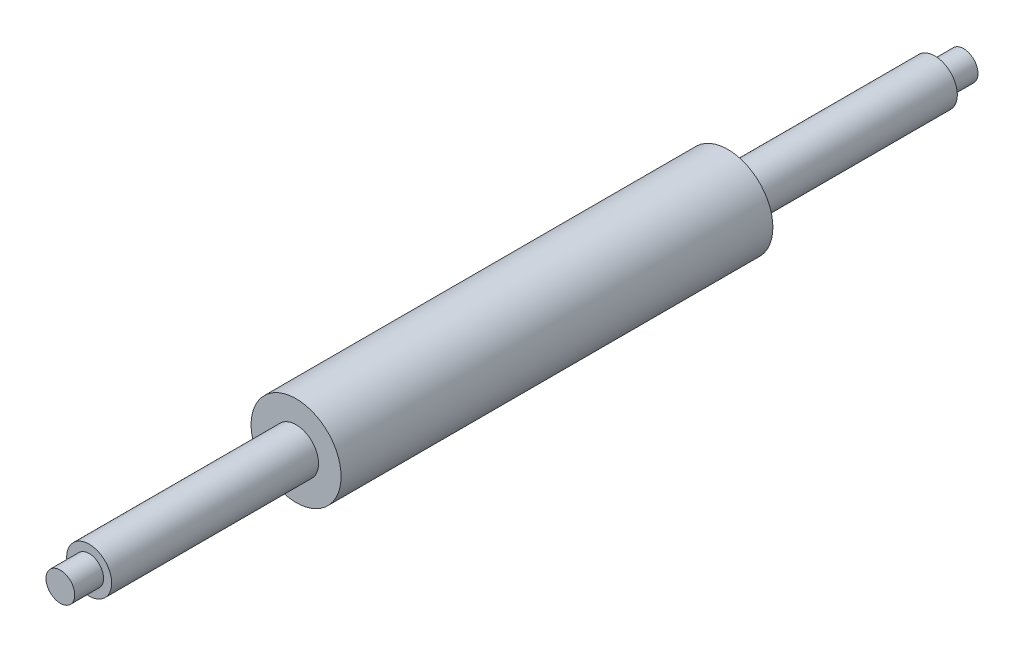
ISO-10303-21;
HEADER;
FILE_DESCRIPTION(('STEP AP214'),'2;1');
FILE_NAME('part.step','',(''),(''),'','','');
FILE_SCHEMA(('AUTOMOTIVE_DESIGN { 1 0 10303 214 1 1 1 1 }'));
ENDSEC;
DATA;
#1=APPLICATION_CONTEXT('core data for automotive mechanical design processes');
#2=APPLICATION_PROTOCOL_DEFINITION('international standard','automotive_design',2000,#1);
#3=PRODUCT_CONTEXT('',#1,'mechanical');
#4=PRODUCT('Part','Part','',(#3));
#5=PRODUCT_RELATED_PRODUCT_CATEGORY('part','',(#4));
#6=PRODUCT_DEFINITION_FORMATION('','',#4);
#7=PRODUCT_DEFINITION_CONTEXT('part definition',#1,'design');
#8=PRODUCT_DEFINITION('design','',#6,#7);
#9=PRODUCT_DEFINITION_SHAPE('','',#8);
#10=(LENGTH_UNIT() NAMED_UNIT(*) SI_UNIT(.MILLI.,.METRE.));
#11=(NAMED_UNIT(*) PLANE_ANGLE_UNIT() SI_UNIT($,.RADIAN.));
#12=(NAMED_UNIT(*) SI_UNIT($,.STERADIAN.) SOLID_ANGLE_UNIT());
#13=UNCERTAINTY_MEASURE_WITH_UNIT(LENGTH_MEASURE(1.E-05),#10,'distance_accuracy_value','');
#14=(GEOMETRIC_REPRESENTATION_CONTEXT(3) GLOBAL_UNCERTAINTY_ASSIGNED_CONTEXT((#13)) GLOBAL_UNIT_ASSIGNED_CONTEXT((#10,
#11,#12)) REPRESENTATION_CONTEXT('',''));
#15=CARTESIAN_POINT('',(0.,0.,0.));
#16=DIRECTION('',(0.,0.,1.));
#17=DIRECTION('',(1.,0.,0.));
#18=AXIS2_PLACEMENT_3D('',#15,#16,#17);
#19=CARTESIAN_POINT('',(0.,0.,60.));
#20=DIRECTION('',(0.,0.,-1.));
#21=DIRECTION('',(-1.,0.,0.));
#22=AXIS2_PLACEMENT_3D('',#19,#20,#21);
#23=CYLINDRICAL_SURFACE('',#22,12.5);
#24=CARTESIAN_POINT('',(-12.5,0.,-7.5));
#25=CARTESIAN_POINT('',(-12.4999985430848,0.191921798249075,-7.4999984365452));
#26=CARTESIAN_POINT('',(-12.495568719545,0.383892122899788,-7.4926217235484));
#27=CARTESIAN_POINT('',(-12.4779545373836,0.766384440440041,-7.46320870674326));
#28=CARTESIAN_POINT('',(-12.4647650564379,0.956905519892443,-7.44116382551773));
#29=CARTESIAN_POINT('',(-12.4299281923194,1.33530916589463,-7.38265997105853));
#30=CARTESIAN_POINT('',(-12.4082647972337,1.52318603568261,-7.3461737085066));
#31=CARTESIAN_POINT('',(-12.3570010567295,1.89465058940149,-7.25924969570034));
#32=CARTESIAN_POINT('',(-12.3273973223774,2.07823640545608,-7.20880598812313));
#33=CARTESIAN_POINT('',(-12.2611319880568,2.43886745755113,-7.09489191572535));
#34=CARTESIAN_POINT('',(-12.2245096265528,2.6159428214286,-7.03149384912067));
#35=CARTESIAN_POINT('',(-12.1448955180684,2.96367122518794,-6.89215176190171));
#36=CARTESIAN_POINT('',(-12.1019013108445,3.13432175230714,-6.81620289396865));
#37=CARTESIAN_POINT('',(-12.010476563191,3.46819544185586,-6.6525300355252));
#38=CARTESIAN_POINT('',(-11.9620500295911,3.63142395541591,-6.56481471460276));
#39=CARTESIAN_POINT('',(-11.860686768855,3.94994870836128,-6.37824475964108));
#40=CARTESIAN_POINT('',(-11.8077483800879,4.10524199137912,-6.27938601732933));
#41=CARTESIAN_POINT('',(-11.6353238707557,4.58131741026127,-5.95124071938056));
#42=CARTESIAN_POINT('',(-11.5093751639425,4.88684096955477,-5.70280170727025));
#43=CARTESIAN_POINT('',(-11.2514863605903,5.45449275250934,-5.16259370663034));
#44=CARTESIAN_POINT('',(-11.1195387379384,5.71656443465284,-4.87076918454309));
#45=CARTESIAN_POINT('',(-10.9180163482214,6.08852554673799,-4.385004918194));
#46=CARTESIAN_POINT('',(-10.8464470278206,6.21477734351409,-4.20421020936036));
#47=CARTESIAN_POINT('',(-10.7073160002908,6.45152832645234,-3.83100607095131));
#48=CARTESIAN_POINT('',(-10.6397549561331,6.5620249109106,-3.63859473053784));
#49=CARTESIAN_POINT('',(-10.5111356727963,6.7661342115073,-3.24327815959601));
#50=CARTESIAN_POINT('',(-10.4500689853567,6.8597689753251,-3.04038708543078));
#51=CARTESIAN_POINT('',(-10.3368448332123,7.02922716887086,-2.62492721648551));
#52=CARTESIAN_POINT('',(-10.2846840457259,7.10505724548748,-2.41236206874753));
#53=CARTESIAN_POINT('',(-10.2029701499711,7.22171525159989,-2.03134991434493));
#54=CARTESIAN_POINT('',(-10.170999428992,7.26657361433481,-1.86464582031261));
#55=CARTESIAN_POINT('',(-10.1146002637467,7.34487549643168,-1.52733809633286));
#56=CARTESIAN_POINT('',(-10.0901701486656,7.37832154465844,-1.35673533924529));
#57=CARTESIAN_POINT('',(-10.0497098691268,7.4333371356005,-1.01281465482376));
#58=CARTESIAN_POINT('',(-10.033671073539,7.45491888284421,-0.839499706980394));
#59=CARTESIAN_POINT('',(-10.0105478350572,7.48594080980444,-0.491181188090445));
#60=CARTESIAN_POINT('',(-10.0034635462963,7.49538078052584,-0.316177588029509));
#61=CARTESIAN_POINT('',(-9.99851937475401,7.50197496073536,0.0345379480199738));
#62=CARTESIAN_POINT('',(-10.0006776794626,7.49910494673155,0.210250600233947));
#63=CARTESIAN_POINT('',(-10.0141753404719,7.48107057297597,0.560684804835286));
#64=CARTESIAN_POINT('',(-10.0255147413814,7.46590615348871,0.735406352402964));
#65=CARTESIAN_POINT('',(-10.0569486368535,7.42350836347631,1.08265177404497));
#66=CARTESIAN_POINT('',(-10.0770470789654,7.39626955113477,1.25517462107758));
#67=CARTESIAN_POINT('',(-10.1252843642805,7.33009470718113,1.5968765252855));
#68=CARTESIAN_POINT('',(-10.1534264932226,7.29115389512323,1.76605418574034));
#69=CARTESIAN_POINT('',(-10.2163904933416,7.20265708143975,2.09781029718825));
#70=CARTESIAN_POINT('',(-10.2511174961488,7.15325079644041,2.26044688493025));
#71=CARTESIAN_POINT('',(-10.3264831977051,7.04401477425678,2.58079782347778));
#72=CARTESIAN_POINT('',(-10.3671238280855,6.98418162996932,2.73851054542555));
#73=CARTESIAN_POINT('',(-10.4963195413646,6.78980796262699,3.20332035148076));
#74=CARTESIAN_POINT('',(-10.5921814170662,6.64034878491715,3.5022531891579));
#75=CARTESIAN_POINT('',(-10.8127887017922,6.27585695706599,4.12500181670132));
#76=CARTESIAN_POINT('',(-10.9396537492766,6.05392839343321,4.44403084011634));
#77=CARTESIAN_POINT('',(-11.1322791458766,5.68696579774525,4.893455340776));
#78=CARTESIAN_POINT('',(-11.1969264346314,5.55885445161762,5.03851112930615));
#79=CARTESIAN_POINT('',(-11.3256679619548,5.29161750299653,5.31847966716556));
#80=CARTESIAN_POINT('',(-11.389762100025,5.15248994388979,5.45339060631267));
#81=CARTESIAN_POINT('',(-11.5248664959838,4.84352337052905,5.73054671993657));
#82=CARTESIAN_POINT('',(-11.5955910064865,4.67210998155133,5.87118061916403));
#83=CARTESIAN_POINT('',(-11.73263678734,4.31642649606306,6.13740847381992));
#84=CARTESIAN_POINT('',(-11.7989597621921,4.13216143374951,6.26300826655045));
#85=CARTESIAN_POINT('',(-11.9254137704905,3.75162576050857,6.49810059921581));
#86=CARTESIAN_POINT('',(-11.9855455372307,3.55535657576306,6.60759504734648));
#87=CARTESIAN_POINT('',(-12.0978943091234,3.15194729181295,6.80926281254276));
#88=CARTESIAN_POINT('',(-12.1501122964741,2.94480854595885,6.9014382794498));
#89=CARTESIAN_POINT('',(-12.2420531904365,2.53446597837191,7.06200527309797));
#90=CARTESIAN_POINT('',(-12.2823558347346,2.33183564416586,7.13152893383911));
#91=CARTESIAN_POINT('',(-12.3534619435042,1.91980902565829,7.25330744348383));
#92=CARTESIAN_POINT('',(-12.3842656806081,1.7104129357343,7.30556278801598));
#93=CARTESIAN_POINT('',(-12.4354102309757,1.2868671133641,7.39193061580728));
#94=CARTESIAN_POINT('',(-12.4557614718837,1.07272234173071,7.42606118191001));
#95=CARTESIAN_POINT('',(-12.4853958595801,0.641532882527487,7.47566116926035));
#96=CARTESIAN_POINT('',(-12.4946805630715,0.42448860716829,7.49113321516023));
#97=CARTESIAN_POINT('',(-12.5013977077804,0.0192857373427629,7.50232977522586));
#98=CARTESIAN_POINT('',(-12.5002700025031,-0.168787906819913,7.50045324245976));
#99=CARTESIAN_POINT('',(-12.4895659482121,-0.544022837371167,7.48260054652061));
#100=CARTESIAN_POINT('',(-12.479989878001,-0.731184153662327,7.46662484863094));
#101=CARTESIAN_POINT('',(-12.4526221910751,-1.10317007072558,7.42079079621312));
#102=CARTESIAN_POINT('',(-12.4348311351581,-1.2879948301185,7.39093338932165));
#103=CARTESIAN_POINT('',(-12.3914568412352,-1.65401559026168,7.31772306484416));
#104=CARTESIAN_POINT('',(-12.3658734097574,-1.83521150079451,7.2743698121778));
#105=CARTESIAN_POINT('',(-12.3082138672793,-2.18839848057125,7.17590990399207));
#106=CARTESIAN_POINT('',(-12.2763130658077,-2.36050634038211,7.12111881049711));
#107=CARTESIAN_POINT('',(-12.2063133435245,-2.69923714475605,6.99975212191653));
#108=CARTESIAN_POINT('',(-12.1682123992206,-2.86585827724116,6.93317267893232));
#109=CARTESIAN_POINT('',(-12.0457213774797,-3.35615670056769,6.7166709449118));
#110=CARTESIAN_POINT('',(-11.9530990642683,-3.67052857953987,6.54991190080987));
#111=CARTESIAN_POINT('',(-11.7422712412733,-4.30007661818615,6.15720610000068));
#112=CARTESIAN_POINT('',(-11.6224084145975,-4.61195177067363,5.9269134196076));
#113=CARTESIAN_POINT('',(-11.3736949797305,-5.19514916038812,5.42301042942474));
#114=CARTESIAN_POINT('',(-11.244834011477,-5.46642348377073,5.14934971179925));
#115=CARTESIAN_POINT('',(-11.0445862325777,-5.85595925215204,4.69094842241578));
#116=CARTESIAN_POINT('',(-10.9725486475353,-5.98949987091459,4.51922027566205));
#117=CARTESIAN_POINT('',(-10.8310862666038,-6.24166951399244,4.16401042900029));
#118=CARTESIAN_POINT('',(-10.7616618925054,-6.36029613825264,3.98052684448601));
#119=CARTESIAN_POINT('',(-10.6277224441709,-6.58166034767794,3.60272854677959));
#120=CARTESIAN_POINT('',(-10.5632033926025,-6.6844108768127,3.40842283474379));
#121=CARTESIAN_POINT('',(-10.4413730391475,-6.87316150637667,3.0096945758837));
#122=CARTESIAN_POINT('',(-10.384059453258,-6.9591669194731,2.80527526366553));
#123=CARTESIAN_POINT('',(-10.2903886001255,-7.09670733690346,2.4325394381496));
#124=CARTESIAN_POINT('',(-10.2521778702183,-7.15167592789611,2.26594943752882));
#125=CARTESIAN_POINT('',(-10.1828307583145,-7.25007474176706,1.92804360893722));
#126=CARTESIAN_POINT('',(-10.1516900773056,-7.29351197913285,1.75673072422112));
#127=CARTESIAN_POINT('',(-10.0975234987595,-7.36832111025433,1.41038949652468));
#128=CARTESIAN_POINT('',(-10.0744899426549,-7.39970439360498,1.23536482661822));
#129=CARTESIAN_POINT('',(-10.0373401260548,-7.4500192164785,0.882584347500492));
#130=CARTESIAN_POINT('',(-10.0232239176239,-7.46895068330038,0.704828522349341));
#131=CARTESIAN_POINT('',(-10.0044277781433,-7.49410941763376,0.347232721104311));
#132=CARTESIAN_POINT('',(-9.99978403272812,-7.50028796895909,0.167387382538947));
#133=CARTESIAN_POINT('',(-10.0002314458485,-7.4996913934028,-0.192269679825566));
#134=CARTESIAN_POINT('',(-10.0053226214934,-7.49291624375474,-0.372081403565081));
#135=CARTESIAN_POINT('',(-10.0250360720896,-7.46651992888389,-0.730311179188335));
#136=CARTESIAN_POINT('',(-10.0396628798425,-7.44689265433152,-0.90872852741109));
#137=CARTESIAN_POINT('',(-10.0778744757253,-7.39509814055963,-1.26274775486685));
#138=CARTESIAN_POINT('',(-10.1014593008446,-7.36293084955999,-1.43834962247109));
#139=CARTESIAN_POINT('',(-10.1553769584842,-7.28836911749912,-1.77715710097497));
#140=CARTESIAN_POINT('',(-10.1853265945128,-7.2465470097527,-1.94055064426202));
#141=CARTESIAN_POINT('',(-10.2516422345012,-7.15242187978739,-2.26298298019979));
#142=CARTESIAN_POINT('',(-10.2880104018376,-7.1001153229581,-2.42202028362828));
#143=CARTESIAN_POINT('',(-10.4052481520199,-6.92820928331201,-2.89152833628017));
#144=CARTESIAN_POINT('',(-10.4942801152033,-6.79358492971536,-3.19456722388378));
#145=CARTESIAN_POINT('',(-10.7006683725987,-6.46442680632607,-3.82167866173841));
#146=CARTESIAN_POINT('',(-10.8202746906701,-6.26386838464329,-4.1418372396271));
#147=CARTESIAN_POINT('',(-11.0045480960382,-5.93010763492978,-4.59555706125437));
#148=CARTESIAN_POINT('',(-11.0668278174544,-5.81327497944236,-4.74246940446227));
#149=CARTESIAN_POINT('',(-11.1917539221139,-5.56897167650257,-5.02709870573982));
#150=CARTESIAN_POINT('',(-11.2544003630625,-5.44149931057837,-5.1648141718856));
#151=CARTESIAN_POINT('',(-11.3889636105884,-5.15466237430539,-5.45226181410206));
#152=CARTESIAN_POINT('',(-11.4607197197764,-4.99349255665734,-5.60027221007155));
#153=CARTESIAN_POINT('',(-11.6010926580952,-4.65807777425059,-5.88220096235632));
#154=CARTESIAN_POINT('',(-11.6697104426032,-4.48383683186237,-6.01612362365556));
#155=CARTESIAN_POINT('',(-11.80207592976,-4.12286082183188,-6.26902006758606));
#156=CARTESIAN_POINT('',(-11.8658201486847,-3.9361169924581,-6.38798319528622));
#157=CARTESIAN_POINT('',(-11.9866432048469,-3.55120509036437,-6.6097092165058));
#158=CARTESIAN_POINT('',(-12.0437228764517,-3.3530384523715,-6.7124741385226));
#159=CARTESIAN_POINT('',(-12.1479788910382,-2.952642030505,-6.89775877768167));
#160=CARTESIAN_POINT('',(-12.195403129165,-2.75071786522497,-6.98079807428311));
#161=CARTESIAN_POINT('',(-12.2810769556124,-2.33867528824146,-7.12941373623336));
#162=CARTESIAN_POINT('',(-12.3193283038591,-2.12855845740477,-7.19499345167298));
#163=CARTESIAN_POINT('',(-12.3853864335246,-1.70250799550625,-7.30752116731637));
#164=CARTESIAN_POINT('',(-12.4132256689102,-1.48659472546369,-7.35452708731223));
#165=CARTESIAN_POINT('',(-12.4577084026555,-1.05045839192144,-7.42936149374829));
#166=CARTESIAN_POINT('',(-12.4743612252339,-0.830239075623945,-7.45720595232956));
#167=CARTESIAN_POINT('',(-12.4900932187085,-0.507810026068092,-7.48347921548552));
#168=CARTESIAN_POINT('',(-12.4938050696703,-0.406391087679503,-7.4896712202708));
#169=CARTESIAN_POINT('',(-12.4987588890391,-0.203319310557774,-7.49793209814404));
#170=CARTESIAN_POINT('',(-12.5000007717697,-0.101666463833427,-7.50000082820671));
#171=CARTESIAN_POINT('',(-12.5,0.,-7.5));
#172=B_SPLINE_CURVE_WITH_KNOTS('',3,(#24,#25,#26,#27,#28,#29,#30,#31,#32,#33,#34,#35,#36,#37,
#38,#39,#40,#41,#42,#43,#44,#45,#46,#47,#48,#49,#50,#51,#52,#53,#54,#55,#56,#57,#58,#59,#60,#61,
#62,#63,#64,#65,#66,#67,#68,#69,#70,#71,#72,#73,#74,#75,#76,#77,#78,#79,#80,#81,#82,#83,#84,#85,
#86,#87,#88,#89,#90,#91,#92,#93,#94,#95,#96,#97,#98,#99,#100,#101,#102,#103,#104,#105,#106,#107,
#108,#109,#110,#111,#112,#113,#114,#115,#116,#117,#118,#119,#120,#121,#122,#123,#124,#125,#126,
#127,#128,#129,#130,#131,#132,#133,#134,#135,#136,#137,#138,#139,#140,#141,#142,#143,#144,#145,
#146,#147,#148,#149,#150,#151,#152,#153,#154,#155,#156,#157,#158,#159,#160,#161,#162,#163,#164,
#165,#166,#167,#168,#169,#170,#171),.UNSPECIFIED.,.T.,.F.,(4,2,2,2,2,2,2,2,2,2,2,2,2,2,2,2,2,2,
2,2,2,2,2,2,2,2,2,2,2,2,2,2,2,2,2,2,2,2,2,2,2,2,2,2,2,2,2,2,2,2,2,2,2,2,2,2,2,2,2,2,2,2,2,2,2,2,
2,2,2,2,2,2,2,4),(0.,0.575658251432628,1.15165342329302,1.72874226752964,2.30607780605299,
2.88027517438834,3.45469482738884,4.02869354596306,4.60290457849094,5.83804312511721,
7.07477648520982,7.76955587953221,8.46444987224585,9.15842855221241,9.85214774099053,
10.3783317787415,10.9043991430731,11.4299243367612,11.9554585761377,12.4820274316384,
13.008598845623,13.5354078221113,14.0624323013587,14.5823729181604,15.1024837515522,
16.1421908624219,17.3636701331933,17.9753557490457,18.5871502524504,19.2844715447335,
19.981521203304,20.6784882072916,21.3753686380633,22.0283690622014,22.6813507425443,
23.3336797222005,23.985916929492,24.5494725537166,25.1130095808644,25.6765081437307,
26.240020698484,26.7896630265487,27.3394850981962,28.4383180966588,29.6511641046257,
30.8654303177994,31.5522303880447,32.239140841448,32.9254882592785,33.6116175658354,
34.1497096204572,34.6874736013784,35.224728200012,35.7619859354243,36.3012922274808,
36.8405994673822,37.3801632562889,37.9197292731809,38.4331000236811,38.9466441382574,
39.9732017979046,41.1573697243671,41.7502714042648,42.3432690326204,43.033312738528,
43.7231449618982,44.4134657684988,45.1037000575925,45.7729957591089,46.442162945515,
47.109226640598,47.7757336253699,48.0806656829064,48.3856083175296),.UNSPECIFIED.);
#173=CARTESIAN_POINT('',(-12.5,0.,-7.5));
#174=VERTEX_POINT('',#173);
#175=EDGE_CURVE('E12',#174,#174,#172,.T.);
#176=ORIENTED_EDGE('',*,*,#175,.T.);
#177=EDGE_LOOP('',(#176));
#178=FACE_BOUND('',#177,.T.);
#179=CARTESIAN_POINT('',(0.,0.,60.));
#180=DIRECTION('',(0.,0.,1.));
#181=DIRECTION('',(1.,0.,0.));
#182=AXIS2_PLACEMENT_3D('',#179,#180,#181);
#183=CIRCLE('',#182,12.5);
#184=CARTESIAN_POINT('',(12.5,0.,60.));
#185=VERTEX_POINT('',#184);
#186=EDGE_CURVE('E62',#185,#185,#183,.T.);
#187=ORIENTED_EDGE('',*,*,#186,.F.);
#188=EDGE_LOOP('',(#187));
#189=FACE_BOUND('',#188,.T.);
#190=CARTESIAN_POINT('',(0.,0.,-60.));
#191=DIRECTION('',(0.,0.,1.));
#192=DIRECTION('',(1.,0.,0.));
#193=AXIS2_PLACEMENT_3D('',#190,#191,#192);
#194=CIRCLE('',#193,12.5);
#195=CARTESIAN_POINT('',(12.5,0.,-60.));
#196=VERTEX_POINT('',#195);
#197=EDGE_CURVE('E73',#196,#196,#194,.T.);
#198=ORIENTED_EDGE('',*,*,#197,.T.);
#199=EDGE_LOOP('',(#198));
#200=FACE_BOUND('',#199,.T.);
#201=ADVANCED_FACE('F50',(#178,#189,#200),#23,.T.);
#202=CARTESIAN_POINT('',(0.,0.,60.));
#203=DIRECTION('',(0.,0.,1.));
#204=DIRECTION('',(1.,0.,0.));
#205=AXIS2_PLACEMENT_3D('',#202,#203,#204);
#206=PLANE('',#205);
#207=CARTESIAN_POINT('',(0.,0.,60.));
#208=DIRECTION('',(0.,0.,1.));
#209=DIRECTION('',(1.,0.,0.));
#210=AXIS2_PLACEMENT_3D('',#207,#208,#209);
#211=CIRCLE('',#210,6.25);
#212=CARTESIAN_POINT('',(-6.25,0.,60.));
#213=VERTEX_POINT('',#212);
#214=EDGE_CURVE('E67',#213,#213,#211,.T.);
#215=ORIENTED_EDGE('',*,*,#214,.F.);
#216=EDGE_LOOP('',(#215));
#217=FACE_BOUND('',#216,.T.);
#218=ORIENTED_EDGE('',*,*,#186,.T.);
#219=EDGE_LOOP('',(#218));
#220=FACE_BOUND('',#219,.T.);
#221=ADVANCED_FACE('F126',(#217,#220),#206,.T.);
#222=CARTESIAN_POINT('',(0.,0.,-60.));
#223=DIRECTION('',(0.,0.,1.));
#224=DIRECTION('',(1.,0.,0.));
#225=AXIS2_PLACEMENT_3D('',#222,#223,#224);
#226=PLANE('',#225);
#227=CARTESIAN_POINT('',(0.,0.,-60.));
#228=DIRECTION('',(0.,0.,1.));
#229=DIRECTION('',(1.,0.,0.));
#230=AXIS2_PLACEMENT_3D('',#227,#228,#229);
#231=CIRCLE('',#230,6.25);
#232=CARTESIAN_POINT('',(-6.25,0.,-60.));
#233=VERTEX_POINT('',#232);
#234=EDGE_CURVE('E78',#233,#233,#231,.F.);
#235=ORIENTED_EDGE('',*,*,#234,.F.);
#236=EDGE_LOOP('',(#235));
#237=FACE_BOUND('',#236,.T.);
#238=ORIENTED_EDGE('',*,*,#197,.F.);
#239=EDGE_LOOP('',(#238));
#240=FACE_BOUND('',#239,.T.);
#241=ADVANCED_FACE('F130',(#237,#240),#226,.F.);
#242=CARTESIAN_POINT('',(0.,0.,117.5));
#243=DIRECTION('',(0.,0.,-1.));
#244=DIRECTION('',(-1.,0.,0.));
#245=AXIS2_PLACEMENT_3D('',#242,#243,#244);
#246=CYLINDRICAL_SURFACE('',#245,6.25);
#247=CARTESIAN_POINT('',(0.,0.,-117.5));
#248=DIRECTION('',(0.,0.,1.));
#249=DIRECTION('',(1.,0.,0.));
#250=AXIS2_PLACEMENT_3D('',#247,#248,#249);
#251=CIRCLE('',#250,6.25);
#252=CARTESIAN_POINT('',(-6.25,0.,-117.5));
#253=VERTEX_POINT('',#252);
#254=EDGE_CURVE('E91',#253,#253,#251,.T.);
#255=CARTESIAN_POINT('',(-6.25,0.,-117.5));
#256=CARTESIAN_POINT('',(-6.25,0.,-116.901041666667));
#257=CARTESIAN_POINT('',(-6.25,0.,-116.302083333333));
#258=CARTESIAN_POINT('',(-6.25,0.,-115.104166666667));
#259=CARTESIAN_POINT('',(-6.25,0.,-114.505208333333));
#260=CARTESIAN_POINT('',(-6.25,0.,-113.307291666667));
#261=CARTESIAN_POINT('',(-6.25,0.,-112.708333333333));
#262=CARTESIAN_POINT('',(-6.25,0.,-111.510416666667));
#263=CARTESIAN_POINT('',(-6.25,0.,-110.911458333333));
#264=CARTESIAN_POINT('',(-6.25,0.,-109.713541666667));
#265=CARTESIAN_POINT('',(-6.25,0.,-109.114583333333));
#266=CARTESIAN_POINT('',(-6.25,0.,-107.916666666667));
#267=CARTESIAN_POINT('',(-6.25,0.,-107.317708333333));
#268=CARTESIAN_POINT('',(-6.25,0.,-106.119791666667));
#269=CARTESIAN_POINT('',(-6.25,0.,-105.520833333333));
#270=CARTESIAN_POINT('',(-6.25,0.,-104.322916666667));
#271=CARTESIAN_POINT('',(-6.25,0.,-103.723958333333));
#272=CARTESIAN_POINT('',(-6.25,0.,-102.526041666667));
#273=CARTESIAN_POINT('',(-6.25,0.,-101.927083333333));
#274=CARTESIAN_POINT('',(-6.25,0.,-100.729166666667));
#275=CARTESIAN_POINT('',(-6.25,0.,-100.130208333333));
#276=CARTESIAN_POINT('',(-6.25,0.,-98.9322916666667));
#277=CARTESIAN_POINT('',(-6.25,0.,-98.3333333333333));
#278=CARTESIAN_POINT('',(-6.25,0.,-97.1354166666667));
#279=CARTESIAN_POINT('',(-6.25,0.,-96.5364583333334));
#280=CARTESIAN_POINT('',(-6.25,0.,-95.3385416666667));
#281=CARTESIAN_POINT('',(-6.25,0.,-94.7395833333334));
#282=CARTESIAN_POINT('',(-6.25,0.,-93.5416666666667));
#283=CARTESIAN_POINT('',(-6.25,0.,-92.9427083333334));
#284=CARTESIAN_POINT('',(-6.25,0.,-91.7447916666667));
#285=CARTESIAN_POINT('',(-6.25,0.,-91.1458333333334));
#286=CARTESIAN_POINT('',(-6.25,0.,-89.9479166666667));
#287=CARTESIAN_POINT('',(-6.25,0.,-89.3489583333334));
#288=CARTESIAN_POINT('',(-6.25,0.,-88.1510416666667));
#289=CARTESIAN_POINT('',(-6.25,0.,-87.5520833333333));
#290=CARTESIAN_POINT('',(-6.25,0.,-86.3541666666667));
#291=CARTESIAN_POINT('',(-6.25,0.,-85.7552083333333));
#292=CARTESIAN_POINT('',(-6.25,0.,-84.5572916666667));
#293=CARTESIAN_POINT('',(-6.25,0.,-83.9583333333334));
#294=CARTESIAN_POINT('',(-6.25,0.,-82.7604166666667));
#295=CARTESIAN_POINT('',(-6.25,0.,-82.1614583333334));
#296=CARTESIAN_POINT('',(-6.25,0.,-80.9635416666667));
#297=CARTESIAN_POINT('',(-6.25,0.,-80.3645833333334));
#298=CARTESIAN_POINT('',(-6.25,0.,-79.1666666666667));
#299=CARTESIAN_POINT('',(-6.25,0.,-78.5677083333334));
#300=CARTESIAN_POINT('',(-6.25,0.,-77.3697916666667));
#301=CARTESIAN_POINT('',(-6.25,0.,-76.7708333333334));
#302=CARTESIAN_POINT('',(-6.25,0.,-75.5729166666667));
#303=CARTESIAN_POINT('',(-6.25,0.,-74.9739583333334));
#304=CARTESIAN_POINT('',(-6.25,0.,-73.7760416666667));
#305=CARTESIAN_POINT('',(-6.25,0.,-73.1770833333334));
#306=CARTESIAN_POINT('',(-6.25,0.,-71.9791666666667));
#307=CARTESIAN_POINT('',(-6.25,0.,-71.3802083333333));
#308=CARTESIAN_POINT('',(-6.25,0.,-70.1822916666667));
#309=CARTESIAN_POINT('',(-6.25,0.,-69.5833333333333));
#310=CARTESIAN_POINT('',(-6.25,0.,-68.3854166666667));
#311=CARTESIAN_POINT('',(-6.25,0.,-67.7864583333334));
#312=CARTESIAN_POINT('',(-6.25,0.,-66.5885416666667));
#313=CARTESIAN_POINT('',(-6.25,0.,-65.9895833333334));
#314=CARTESIAN_POINT('',(-6.25,0.,-64.7916666666667));
#315=CARTESIAN_POINT('',(-6.25,0.,-64.1927083333334));
#316=CARTESIAN_POINT('',(-6.25,0.,-62.9947916666667));
#317=CARTESIAN_POINT('',(-6.25,0.,-62.3958333333334));
#318=CARTESIAN_POINT('',(-6.25,0.,-61.1979166666667));
#319=CARTESIAN_POINT('',(-6.25,0.,-60.5989583333334));
#320=CARTESIAN_POINT('',(-6.25,0.,-60.));
#321=B_SPLINE_CURVE_WITH_KNOTS('',3,(#255,#256,#257,#258,#259,#260,#261,#262,#263,#264,#265,
#266,#267,#268,#269,#270,#271,#272,#273,#274,#275,#276,#277,#278,#279,#280,#281,#282,#283,#284,
#285,#286,#287,#288,#289,#290,#291,#292,#293,#294,#295,#296,#297,#298,#299,#300,#301,#302,#303,
#304,#305,#306,#307,#308,#309,#310,#311,#312,#313,#314,#315,#316,#317,#318,#319,#320),
.UNSPECIFIED.,.F.,.F.,(4,2,2,2,2,2,2,2,2,2,2,2,2,2,2,2,2,2,2,2,2,2,2,2,2,2,2,2,2,2,2,2,4),(0.,
1.796875,3.59375000000001,5.39062500000001,7.18750000000001,8.98437499999999,10.78125,12.578125,
14.375,16.171875,17.96875,19.765625,21.5625,23.359375,25.15625,26.953125,28.75,30.546875,
32.34375,34.140625,35.9375,37.734375,39.53125,41.328125,43.125,44.921875,46.71875,48.515625,
50.3125,52.109375,53.90625,55.703125,57.5),.UNSPECIFIED.);
#322=EDGE_CURVE('BSEAM137',#253,#233,#321,.T.);
#323=ORIENTED_EDGE('',*,*,#254,.T.);
#324=ORIENTED_EDGE('',*,*,#234,.T.);
#325=ORIENTED_EDGE('',*,*,#322,.T.);
#326=ORIENTED_EDGE('',*,*,#322,.F.);
#327=EDGE_LOOP('',(#323,#325,#324,#326));
#328=FACE_BOUND('',#327,.T.);
#329=ADVANCED_FACE('F137',(#328),#246,.T.);
#330=CARTESIAN_POINT('',(0.,0.,117.5));
#331=DIRECTION('',(0.,0.,1.));
#332=DIRECTION('',(1.,0.,0.));
#333=AXIS2_PLACEMENT_3D('',#330,#331,#332);
#334=CIRCLE('',#333,6.25);
#335=CARTESIAN_POINT('',(-6.25,0.,117.5));
#336=VERTEX_POINT('',#335);
#337=EDGE_CURVE('E83',#336,#336,#334,.T.);
#338=CARTESIAN_POINT('',(-6.25,0.,60.));
#339=CARTESIAN_POINT('',(-6.25,0.,60.5989583333333));
#340=CARTESIAN_POINT('',(-6.25,0.,61.1979166666667));
#341=CARTESIAN_POINT('',(-6.25,0.,62.3958333333333));
#342=CARTESIAN_POINT('',(-6.25,0.,62.9947916666667));
#343=CARTESIAN_POINT('',(-6.25,0.,64.1927083333333));
#344=CARTESIAN_POINT('',(-6.25,0.,64.7916666666667));
#345=CARTESIAN_POINT('',(-6.25,0.,65.9895833333333));
#346=CARTESIAN_POINT('',(-6.25,0.,66.5885416666667));
#347=CARTESIAN_POINT('',(-6.25,0.,67.7864583333333));
#348=CARTESIAN_POINT('',(-6.25,0.,68.3854166666667));
#349=CARTESIAN_POINT('',(-6.25,0.,69.5833333333333));
#350=CARTESIAN_POINT('',(-6.25,0.,70.1822916666667));
#351=CARTESIAN_POINT('',(-6.25,0.,71.3802083333333));
#352=CARTESIAN_POINT('',(-6.25,0.,71.9791666666667));
#353=CARTESIAN_POINT('',(-6.25,0.,73.1770833333333));
#354=CARTESIAN_POINT('',(-6.25,0.,73.7760416666667));
#355=CARTESIAN_POINT('',(-6.25,0.,74.9739583333333));
#356=CARTESIAN_POINT('',(-6.25,0.,75.5729166666667));
#357=CARTESIAN_POINT('',(-6.25,0.,76.7708333333333));
#358=CARTESIAN_POINT('',(-6.25,0.,77.3697916666667));
#359=CARTESIAN_POINT('',(-6.25,0.,78.5677083333333));
#360=CARTESIAN_POINT('',(-6.25,0.,79.1666666666667));
#361=CARTESIAN_POINT('',(-6.25,0.,80.3645833333333));
#362=CARTESIAN_POINT('',(-6.25,0.,80.9635416666667));
#363=CARTESIAN_POINT('',(-6.25,0.,82.1614583333333));
#364=CARTESIAN_POINT('',(-6.25,0.,82.7604166666667));
#365=CARTESIAN_POINT('',(-6.25,0.,83.9583333333333));
#366=CARTESIAN_POINT('',(-6.25,0.,84.5572916666667));
#367=CARTESIAN_POINT('',(-6.25,0.,85.7552083333333));
#368=CARTESIAN_POINT('',(-6.25,0.,86.3541666666667));
#369=CARTESIAN_POINT('',(-6.25,0.,87.5520833333333));
#370=CARTESIAN_POINT('',(-6.25,0.,88.1510416666667));
#371=CARTESIAN_POINT('',(-6.25,0.,89.3489583333333));
#372=CARTESIAN_POINT('',(-6.25,0.,89.9479166666667));
#373=CARTESIAN_POINT('',(-6.25,0.,91.1458333333333));
#374=CARTESIAN_POINT('',(-6.25,0.,91.7447916666667));
#375=CARTESIAN_POINT('',(-6.25,0.,92.9427083333333));
#376=CARTESIAN_POINT('',(-6.25,0.,93.5416666666667));
#377=CARTESIAN_POINT('',(-6.25,0.,94.7395833333333));
#378=CARTESIAN_POINT('',(-6.25,0.,95.3385416666667));
#379=CARTESIAN_POINT('',(-6.25,0.,96.5364583333333));
#380=CARTESIAN_POINT('',(-6.25,0.,97.1354166666667));
#381=CARTESIAN_POINT('',(-6.25,0.,98.3333333333333));
#382=CARTESIAN_POINT('',(-6.25,0.,98.9322916666667));
#383=CARTESIAN_POINT('',(-6.25,0.,100.130208333333));
#384=CARTESIAN_POINT('',(-6.25,0.,100.729166666667));
#385=CARTESIAN_POINT('',(-6.25,0.,101.927083333333));
#386=CARTESIAN_POINT('',(-6.25,0.,102.526041666667));
#387=CARTESIAN_POINT('',(-6.25,0.,103.723958333333));
#388=CARTESIAN_POINT('',(-6.25,0.,104.322916666667));
#389=CARTESIAN_POINT('',(-6.25,0.,105.520833333333));
#390=CARTESIAN_POINT('',(-6.25,0.,106.119791666667));
#391=CARTESIAN_POINT('',(-6.25,0.,107.317708333333));
#392=CARTESIAN_POINT('',(-6.25,0.,107.916666666667));
#393=CARTESIAN_POINT('',(-6.25,0.,109.114583333333));
#394=CARTESIAN_POINT('',(-6.25,0.,109.713541666667));
#395=CARTESIAN_POINT('',(-6.25,0.,110.911458333333));
#396=CARTESIAN_POINT('',(-6.25,0.,111.510416666667));
#397=CARTESIAN_POINT('',(-6.25,0.,112.708333333333));
#398=CARTESIAN_POINT('',(-6.25,0.,113.307291666667));
#399=CARTESIAN_POINT('',(-6.25,0.,114.505208333333));
#400=CARTESIAN_POINT('',(-6.25,0.,115.104166666667));
#401=CARTESIAN_POINT('',(-6.25,0.,116.302083333333));
#402=CARTESIAN_POINT('',(-6.25,0.,116.901041666667));
#403=CARTESIAN_POINT('',(-6.25,0.,117.5));
#404=B_SPLINE_CURVE_WITH_KNOTS('',3,(#338,#339,#340,#341,#342,#343,#344,#345,#346,#347,#348,
#349,#350,#351,#352,#353,#354,#355,#356,#357,#358,#359,#360,#361,#362,#363,#364,#365,#366,#367,
#368,#369,#370,#371,#372,#373,#374,#375,#376,#377,#378,#379,#380,#381,#382,#383,#384,#385,#386,
#387,#388,#389,#390,#391,#392,#393,#394,#395,#396,#397,#398,#399,#400,#401,#402,#403),
.UNSPECIFIED.,.F.,.F.,(4,2,2,2,2,2,2,2,2,2,2,2,2,2,2,2,2,2,2,2,2,2,2,2,2,2,2,2,2,2,2,2,4),(0.,
1.796875,3.59375,5.390625,7.18749999999999,8.984375,10.78125,12.578125,14.375,16.171875,
17.96875,19.765625,21.5625,23.359375,25.15625,26.953125,28.75,30.546875,32.34375,34.140625,
35.9375,37.734375,39.53125,41.328125,43.125,44.921875,46.71875,48.515625,50.3125,52.109375,
53.90625,55.703125,57.5),.UNSPECIFIED.);
#405=EDGE_CURVE('BSEAM141',#213,#336,#404,.T.);
#406=ORIENTED_EDGE('',*,*,#214,.T.);
#407=ORIENTED_EDGE('',*,*,#337,.F.);
#408=ORIENTED_EDGE('',*,*,#405,.T.);
#409=ORIENTED_EDGE('',*,*,#405,.F.);
#410=EDGE_LOOP('',(#406,#408,#407,#409));
#411=FACE_BOUND('',#410,.T.);
#412=ADVANCED_FACE('F141',(#411),#246,.T.);
#413=CARTESIAN_POINT('',(0.,0.,117.5));
#414=DIRECTION('',(0.,0.,1.));
#415=DIRECTION('',(1.,0.,0.));
#416=AXIS2_PLACEMENT_3D('',#413,#414,#415);
#417=PLANE('',#416);
#418=CARTESIAN_POINT('',(0.,0.,117.5));
#419=DIRECTION('',(0.,0.,1.));
#420=DIRECTION('',(1.,0.,0.));
#421=AXIS2_PLACEMENT_3D('',#418,#419,#420);
#422=CIRCLE('',#421,4.);
#423=CARTESIAN_POINT('',(4.,0.,117.5));
#424=VERTEX_POINT('',#423);
#425=EDGE_CURVE('E88',#424,#424,#422,.T.);
#426=ORIENTED_EDGE('',*,*,#425,.F.);
#427=EDGE_LOOP('',(#426));
#428=FACE_BOUND('',#427,.T.);
#429=ORIENTED_EDGE('',*,*,#337,.T.);
#430=EDGE_LOOP('',(#429));
#431=FACE_BOUND('',#430,.T.);
#432=ADVANCED_FACE('F144',(#428,#431),#417,.T.);
#433=CARTESIAN_POINT('',(0.,0.,-117.5));
#434=DIRECTION('',(0.,0.,1.));
#435=DIRECTION('',(1.,0.,0.));
#436=AXIS2_PLACEMENT_3D('',#433,#434,#435);
#437=PLANE('',#436);
#438=CARTESIAN_POINT('',(0.,0.,-117.5));
#439=DIRECTION('',(0.,0.,1.));
#440=DIRECTION('',(1.,0.,0.));
#441=AXIS2_PLACEMENT_3D('',#438,#439,#440);
#442=CIRCLE('',#441,4.);
#443=CARTESIAN_POINT('',(4.,0.,-117.5));
#444=VERTEX_POINT('',#443);
#445=EDGE_CURVE('E94',#444,#444,#442,.F.);
#446=ORIENTED_EDGE('',*,*,#445,.F.);
#447=EDGE_LOOP('',(#446));
#448=FACE_BOUND('',#447,.T.);
#449=ORIENTED_EDGE('',*,*,#254,.F.);
#450=EDGE_LOOP('',(#449));
#451=FACE_BOUND('',#450,.T.);
#452=ADVANCED_FACE('F146',(#448,#451),#437,.F.);
#453=CARTESIAN_POINT('',(0.,0.,-125.5));
#454=DIRECTION('',(0.,0.,1.));
#455=DIRECTION('',(1.,0.,0.));
#456=AXIS2_PLACEMENT_3D('',#453,#454,#455);
#457=PLANE('',#456);
#458=CARTESIAN_POINT('',(0.,0.,-125.5));
#459=DIRECTION('',(0.,0.,1.));
#460=DIRECTION('',(1.,0.,0.));
#461=AXIS2_PLACEMENT_3D('',#458,#459,#460);
#462=CIRCLE('',#461,4.);
#463=CARTESIAN_POINT('',(4.,0.,-125.5));
#464=VERTEX_POINT('',#463);
#465=EDGE_CURVE('E103',#464,#464,#462,.T.);
#466=ORIENTED_EDGE('',*,*,#465,.F.);
#467=EDGE_LOOP('',(#466));
#468=FACE_BOUND('',#467,.T.);
#469=ADVANCED_FACE('F149',(#468),#457,.F.);
#470=CARTESIAN_POINT('',(0.,0.,125.5));
#471=DIRECTION('',(0.,0.,-1.));
#472=DIRECTION('',(-1.,0.,0.));
#473=AXIS2_PLACEMENT_3D('',#470,#471,#472);
#474=CYLINDRICAL_SURFACE('',#473,4.);
#475=ORIENTED_EDGE('',*,*,#465,.T.);
#476=EDGE_LOOP('',(#475));
#477=FACE_BOUND('',#476,.T.);
#478=ORIENTED_EDGE('',*,*,#445,.T.);
#479=EDGE_LOOP('',(#478));
#480=FACE_BOUND('',#479,.T.);
#481=ADVANCED_FACE('F157',(#477,#480),#474,.T.);
#482=ORIENTED_EDGE('',*,*,#425,.T.);
#483=EDGE_LOOP('',(#482));
#484=FACE_BOUND('',#483,.T.);
#485=CARTESIAN_POINT('',(0.,0.,125.5));
#486=DIRECTION('',(0.,0.,1.));
#487=DIRECTION('',(1.,0.,0.));
#488=AXIS2_PLACEMENT_3D('',#485,#486,#487);
#489=CIRCLE('',#488,4.);
#490=CARTESIAN_POINT('',(4.,0.,125.5));
#491=VERTEX_POINT('',#490);
#492=EDGE_CURVE('E102',#491,#491,#489,.T.);
#493=ORIENTED_EDGE('',*,*,#492,.F.);
#494=EDGE_LOOP('',(#493));
#495=FACE_BOUND('',#494,.T.);
#496=ADVANCED_FACE('F154',(#484,#495),#474,.T.);
#497=CARTESIAN_POINT('',(0.,0.,125.5));
#498=DIRECTION('',(0.,0.,1.));
#499=DIRECTION('',(1.,0.,0.));
#500=AXIS2_PLACEMENT_3D('',#497,#498,#499);
#501=PLANE('',#500);
#502=ORIENTED_EDGE('',*,*,#492,.T.);
#503=EDGE_LOOP('',(#502));
#504=FACE_BOUND('',#503,.T.);
#505=ADVANCED_FACE('F124',(#504),#501,.T.);
#506=CARTESIAN_POINT('',(-12.5,0.,0.));
#507=DIRECTION('',(1.,0.,0.));
#508=DIRECTION('',(0.,0.,-1.));
#509=AXIS2_PLACEMENT_3D('',#506,#507,#508);
#510=CYLINDRICAL_SURFACE('',#509,7.5);
#511=CARTESIAN_POINT('',(0.,0.,0.));
#512=DIRECTION('',(1.,0.,0.));
#513=DIRECTION('',(0.,0.,-1.));
#514=AXIS2_PLACEMENT_3D('',#511,#512,#513);
#515=CIRCLE('',#514,7.5);
#516=CARTESIAN_POINT('',(0.,0.,-7.5));
#517=VERTEX_POINT('',#516);
#518=EDGE_CURVE('E107',#517,#517,#515,.T.);
#519=ORIENTED_EDGE('',*,*,#518,.T.);
#520=EDGE_LOOP('',(#519));
#521=FACE_BOUND('',#520,.T.);
#522=ORIENTED_EDGE('',*,*,#175,.F.);
#523=EDGE_LOOP('',(#522));
#524=FACE_BOUND('',#523,.T.);
#525=ADVANCED_FACE('F115',(#521,#524),#510,.F.);
#526=CARTESIAN_POINT('',(0.,0.,0.));
#527=DIRECTION('',(1.,0.,0.));
#528=DIRECTION('',(0.,0.,-1.));
#529=AXIS2_PLACEMENT_3D('',#526,#527,#528);
#530=PLANE('',#529);
#531=ORIENTED_EDGE('',*,*,#518,.F.);
#532=EDGE_LOOP('',(#531));
#533=FACE_BOUND('',#532,.T.);
#534=ADVANCED_FACE('F118',(#533),#530,.F.);
#535=CLOSED_SHELL('',(#201,#221,#241,#329,#412,#432,#452,#469,#481,#496,#505,#525,#534));
#536=MANIFOLD_SOLID_BREP('B2',#535);
#537=ADVANCED_BREP_SHAPE_REPRESENTATION('',(#18,#536),#14);
#538=SHAPE_DEFINITION_REPRESENTATION(#9,#537);
ENDSEC;
END-ISO-10303-21;
